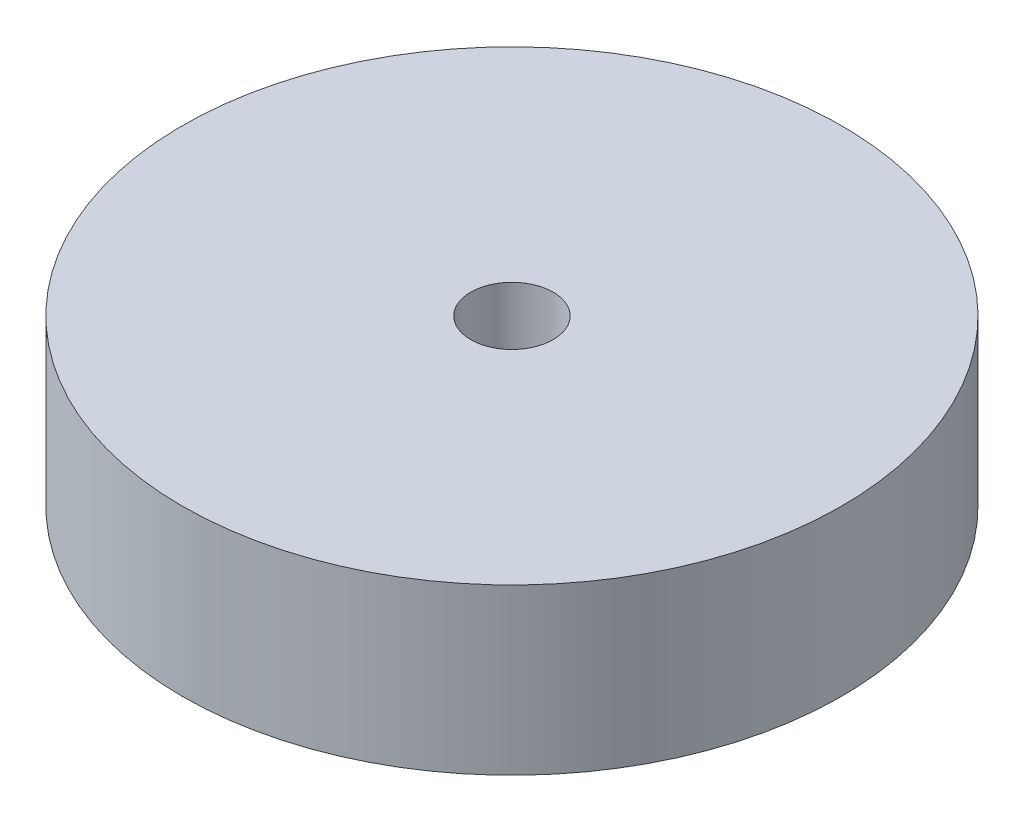
ISO-10303-21;
HEADER;
FILE_DESCRIPTION(('STEP AP214'),'2;1');
FILE_NAME('part.step','',(''),(''),'','','');
FILE_SCHEMA(('AUTOMOTIVE_DESIGN { 1 0 10303 214 1 1 1 1 }'));
ENDSEC;
DATA;
#1=APPLICATION_CONTEXT('core data for automotive mechanical design processes');
#2=APPLICATION_PROTOCOL_DEFINITION('international standard','automotive_design',2000,#1);
#3=PRODUCT_CONTEXT('',#1,'mechanical');
#4=PRODUCT('Part','Part','',(#3));
#5=PRODUCT_RELATED_PRODUCT_CATEGORY('part','',(#4));
#6=PRODUCT_DEFINITION_FORMATION('','',#4);
#7=PRODUCT_DEFINITION_CONTEXT('part definition',#1,'design');
#8=PRODUCT_DEFINITION('design','',#6,#7);
#9=PRODUCT_DEFINITION_SHAPE('','',#8);
#10=(LENGTH_UNIT() NAMED_UNIT(*) SI_UNIT(.MILLI.,.METRE.));
#11=(NAMED_UNIT(*) PLANE_ANGLE_UNIT() SI_UNIT($,.RADIAN.));
#12=(NAMED_UNIT(*) SI_UNIT($,.STERADIAN.) SOLID_ANGLE_UNIT());
#13=UNCERTAINTY_MEASURE_WITH_UNIT(LENGTH_MEASURE(1.E-05),#10,'distance_accuracy_value','');
#14=(GEOMETRIC_REPRESENTATION_CONTEXT(3) GLOBAL_UNCERTAINTY_ASSIGNED_CONTEXT((#13)) GLOBAL_UNIT_ASSIGNED_CONTEXT((#10,
#11,#12)) REPRESENTATION_CONTEXT('',''));
#15=CARTESIAN_POINT('',(0.,0.,0.));
#16=DIRECTION('',(0.,0.,1.));
#17=DIRECTION('',(1.,0.,0.));
#18=AXIS2_PLACEMENT_3D('',#15,#16,#17);
#19=CARTESIAN_POINT('',(0.,50.8,0.));
#20=DIRECTION('',(0.,1.,0.));
#21=DIRECTION('',(0.,0.,1.));
#22=AXIS2_PLACEMENT_3D('',#19,#20,#21);
#23=PLANE('',#22);
#24=CARTESIAN_POINT('',(0.,50.8,0.));
#25=DIRECTION('',(0.,1.,0.));
#26=DIRECTION('',(0.,0.,1.));
#27=AXIS2_PLACEMENT_3D('',#24,#25,#26);
#28=CIRCLE('',#27,101.6);
#29=CARTESIAN_POINT('',(0.,50.8,101.6));
#30=VERTEX_POINT('',#29);
#31=EDGE_CURVE('E10',#30,#30,#28,.T.);
#32=ORIENTED_EDGE('',*,*,#31,.T.);
#33=EDGE_LOOP('',(#32));
#34=FACE_BOUND('',#33,.T.);
#35=CARTESIAN_POINT('',(0.,50.8,0.));
#36=DIRECTION('',(0.,1.,0.));
#37=DIRECTION('',(0.,0.,1.));
#38=AXIS2_PLACEMENT_3D('',#35,#36,#37);
#39=CIRCLE('',#38,12.7);
#40=CARTESIAN_POINT('',(0.,50.8,12.7));
#41=VERTEX_POINT('',#40);
#42=EDGE_CURVE('E44',#41,#41,#39,.T.);
#43=ORIENTED_EDGE('',*,*,#42,.F.);
#44=EDGE_LOOP('',(#43));
#45=FACE_BOUND('',#44,.T.);
#46=ADVANCED_FACE('F33',(#34,#45),#23,.T.);
#47=CARTESIAN_POINT('',(0.,0.,0.));
#48=DIRECTION('',(0.,1.,0.));
#49=DIRECTION('',(0.,0.,1.));
#50=AXIS2_PLACEMENT_3D('',#47,#48,#49);
#51=PLANE('',#50);
#52=CARTESIAN_POINT('',(0.,0.,0.));
#53=DIRECTION('',(0.,1.,0.));
#54=DIRECTION('',(0.,0.,1.));
#55=AXIS2_PLACEMENT_3D('',#52,#53,#54);
#56=CIRCLE('',#55,101.6);
#57=CARTESIAN_POINT('',(0.,0.,101.6));
#58=VERTEX_POINT('',#57);
#59=EDGE_CURVE('E37',#58,#58,#56,.T.);
#60=ORIENTED_EDGE('',*,*,#59,.F.);
#61=EDGE_LOOP('',(#60));
#62=FACE_BOUND('',#61,.T.);
#63=CARTESIAN_POINT('',(0.,0.,0.));
#64=DIRECTION('',(0.,1.,0.));
#65=DIRECTION('',(0.,0.,1.));
#66=AXIS2_PLACEMENT_3D('',#63,#64,#65);
#67=CIRCLE('',#66,12.7);
#68=CARTESIAN_POINT('',(0.,0.,12.7));
#69=VERTEX_POINT('',#68);
#70=EDGE_CURVE('E46',#69,#69,#67,.T.);
#71=ORIENTED_EDGE('',*,*,#70,.T.);
#72=EDGE_LOOP('',(#71));
#73=FACE_BOUND('',#72,.T.);
#74=ADVANCED_FACE('F56',(#62,#73),#51,.F.);
#75=CARTESIAN_POINT('',(0.,50.8,0.));
#76=DIRECTION('',(0.,-1.,0.));
#77=DIRECTION('',(0.,0.,-1.));
#78=AXIS2_PLACEMENT_3D('',#75,#76,#77);
#79=CYLINDRICAL_SURFACE('',#78,101.6);
#80=ORIENTED_EDGE('',*,*,#31,.F.);
#81=EDGE_LOOP('',(#80));
#82=FACE_BOUND('',#81,.T.);
#83=ORIENTED_EDGE('',*,*,#59,.T.);
#84=EDGE_LOOP('',(#83));
#85=FACE_BOUND('',#84,.T.);
#86=ADVANCED_FACE('F35',(#82,#85),#79,.T.);
#87=CARTESIAN_POINT('',(0.,50.8,0.));
#88=DIRECTION('',(0.,-1.,0.));
#89=DIRECTION('',(0.,0.,-1.));
#90=AXIS2_PLACEMENT_3D('',#87,#88,#89);
#91=CYLINDRICAL_SURFACE('',#90,12.7);
#92=ORIENTED_EDGE('',*,*,#42,.T.);
#93=EDGE_LOOP('',(#92));
#94=FACE_BOUND('',#93,.T.);
#95=ORIENTED_EDGE('',*,*,#70,.F.);
#96=EDGE_LOOP('',(#95));
#97=FACE_BOUND('',#96,.T.);
#98=ADVANCED_FACE('F52',(#94,#97),#91,.F.);
#99=CLOSED_SHELL('',(#46,#74,#86,#98));
#100=MANIFOLD_SOLID_BREP('B2',#99);
#101=ADVANCED_BREP_SHAPE_REPRESENTATION('',(#18,#100),#14);
#102=SHAPE_DEFINITION_REPRESENTATION(#9,#101);
ENDSEC;
END-ISO-10303-21;
